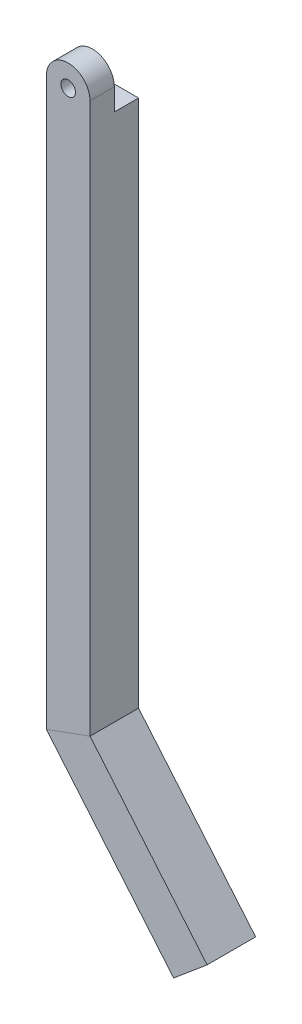
ISO-10303-21;
HEADER;
FILE_DESCRIPTION(('STEP AP214'),'2;1');
FILE_NAME('part.step','',(''),(''),'','','');
FILE_SCHEMA(('AUTOMOTIVE_DESIGN { 1 0 10303 214 1 1 1 1 }'));
ENDSEC;
DATA;
#1=APPLICATION_CONTEXT('core data for automotive mechanical design processes');
#2=APPLICATION_PROTOCOL_DEFINITION('international standard','automotive_design',2000,#1);
#3=PRODUCT_CONTEXT('',#1,'mechanical');
#4=PRODUCT('Part','Part','',(#3));
#5=PRODUCT_RELATED_PRODUCT_CATEGORY('part','',(#4));
#6=PRODUCT_DEFINITION_FORMATION('','',#4);
#7=PRODUCT_DEFINITION_CONTEXT('part definition',#1,'design');
#8=PRODUCT_DEFINITION('design','',#6,#7);
#9=PRODUCT_DEFINITION_SHAPE('','',#8);
#10=(LENGTH_UNIT() NAMED_UNIT(*) SI_UNIT(.MILLI.,.METRE.));
#11=(NAMED_UNIT(*) PLANE_ANGLE_UNIT() SI_UNIT($,.RADIAN.));
#12=(NAMED_UNIT(*) SI_UNIT($,.STERADIAN.) SOLID_ANGLE_UNIT());
#13=UNCERTAINTY_MEASURE_WITH_UNIT(LENGTH_MEASURE(1.E-05),#10,'distance_accuracy_value','');
#14=(GEOMETRIC_REPRESENTATION_CONTEXT(3) GLOBAL_UNCERTAINTY_ASSIGNED_CONTEXT((#13)) GLOBAL_UNIT_ASSIGNED_CONTEXT((#10,
#11,#12)) REPRESENTATION_CONTEXT('',''));
#15=CARTESIAN_POINT('',(0.,0.,0.));
#16=DIRECTION('',(0.,0.,1.));
#17=DIRECTION('',(1.,0.,0.));
#18=AXIS2_PLACEMENT_3D('',#15,#16,#17);
#19=CARTESIAN_POINT('',(-19.8,5.,-1.04285714285714));
#20=DIRECTION('',(0.,0.,1.));
#21=DIRECTION('',(1.,0.,0.));
#22=AXIS2_PLACEMENT_3D('',#19,#20,#21);
#23=CYLINDRICAL_SURFACE('',#22,4.5);
#24=CARTESIAN_POINT('',(-19.8,4.99999999999998,3.95714285714286));
#25=DIRECTION('',(0.,0.,1.));
#26=DIRECTION('',(-1.,0.,0.));
#27=AXIS2_PLACEMENT_3D('',#24,#25,#26);
#28=CIRCLE('',#27,4.5);
#29=CARTESIAN_POINT('',(-15.3,5.,3.95714285714286));
#30=VERTEX_POINT('',#29);
#31=CARTESIAN_POINT('',(-24.3,5.,3.95714285714286));
#32=VERTEX_POINT('',#31);
#33=EDGE_CURVE('E124',#30,#32,#28,.T.);
#34=ORIENTED_EDGE('',*,*,#33,.T.);
#35=DIRECTION('',(0.,0.,1.));
#36=VECTOR('',#35,1.);
#37=CARTESIAN_POINT('',(-24.3,5.,-1.04285714285714));
#38=LINE('',#37,#36);
#39=CARTESIAN_POINT('',(-24.3,5.,8.95714285714286));
#40=VERTEX_POINT('',#39);
#41=EDGE_CURVE('E122',#32,#40,#38,.T.);
#42=ORIENTED_EDGE('',*,*,#41,.T.);
#43=CARTESIAN_POINT('',(-19.8,5.,8.95714285714286));
#44=DIRECTION('',(0.,0.,-1.));
#45=DIRECTION('',(-1.,0.,0.));
#46=AXIS2_PLACEMENT_3D('',#43,#44,#45);
#47=CIRCLE('',#46,4.5);
#48=CARTESIAN_POINT('',(-15.3,5.,8.95714285714286));
#49=VERTEX_POINT('',#48);
#50=EDGE_CURVE('E140',#40,#49,#47,.T.);
#51=ORIENTED_EDGE('',*,*,#50,.T.);
#52=DIRECTION('',(0.,0.,1.));
#53=VECTOR('',#52,1.);
#54=CARTESIAN_POINT('',(-15.3,5.,-1.04285714285714));
#55=LINE('',#54,#53);
#56=EDGE_CURVE('E63',#30,#49,#55,.T.);
#57=ORIENTED_EDGE('',*,*,#56,.F.);
#58=EDGE_LOOP('',(#34,#42,#51,#57));
#59=FACE_BOUND('',#58,.T.);
#60=ADVANCED_FACE('F39',(#59),#23,.T.);
#61=CARTESIAN_POINT('',(-15.3,10.,-1.04285714285714));
#62=DIRECTION('',(-1.,0.,0.));
#63=DIRECTION('',(0.,0.,1.));
#64=AXIS2_PLACEMENT_3D('',#61,#62,#63);
#65=PLANE('',#64);
#66=DIRECTION('',(0.,-1.,0.));
#67=VECTOR('',#66,1.);
#68=CARTESIAN_POINT('',(-15.3,10.,-1.04285714285714));
#69=LINE('',#68,#67);
#70=CARTESIAN_POINT('',(-15.3,0.5,-1.04285714285714));
#71=VERTEX_POINT('',#70);
#72=CARTESIAN_POINT('',(-15.3,-108.362133945802,-1.04285714285714));
#73=VERTEX_POINT('',#72);
#74=EDGE_CURVE('E189',#71,#73,#69,.T.);
#75=ORIENTED_EDGE('',*,*,#74,.F.);
#76=DIRECTION('',(0.,0.,1.));
#77=VECTOR('',#76,1.);
#78=CARTESIAN_POINT('',(-15.3,0.5,-6.04285714285714));
#79=LINE('',#78,#77);
#80=CARTESIAN_POINT('',(-15.3,0.5,3.95714285714286));
#81=VERTEX_POINT('',#80);
#82=EDGE_CURVE('E113',#71,#81,#79,.T.);
#83=ORIENTED_EDGE('',*,*,#82,.T.);
#84=DIRECTION('',(0.,1.,0.));
#85=VECTOR('',#84,1.);
#86=CARTESIAN_POINT('',(-15.3,0.5,3.95714285714286));
#87=LINE('',#86,#85);
#88=EDGE_CURVE('E114',#81,#30,#87,.T.);
#89=ORIENTED_EDGE('',*,*,#88,.T.);
#90=ORIENTED_EDGE('',*,*,#56,.T.);
#91=DIRECTION('',(0.,-1.,0.));
#92=VECTOR('',#91,1.);
#93=CARTESIAN_POINT('',(-15.3,10.,8.95714285714286));
#94=LINE('',#93,#92);
#95=CARTESIAN_POINT('',(-15.3,-108.362133945802,8.95714285714286));
#96=VERTEX_POINT('',#95);
#97=EDGE_CURVE('E192',#49,#96,#94,.T.);
#98=ORIENTED_EDGE('',*,*,#97,.T.);
#99=DIRECTION('',(0.,0.,1.));
#100=VECTOR('',#99,1.);
#101=CARTESIAN_POINT('',(-15.3,-108.362133945802,-1.04285714285714));
#102=LINE('',#101,#100);
#103=EDGE_CURVE('E149',#73,#96,#102,.T.);
#104=ORIENTED_EDGE('',*,*,#103,.F.);
#105=EDGE_LOOP('',(#75,#83,#89,#90,#98,#104));
#106=FACE_BOUND('',#105,.T.);
#107=ADVANCED_FACE('F216',(#106),#65,.F.);
#108=CARTESIAN_POINT('',(-24.3,10.,8.95714285714286));
#109=DIRECTION('',(1.,0.,0.));
#110=DIRECTION('',(0.,0.,-1.));
#111=AXIS2_PLACEMENT_3D('',#108,#109,#110);
#112=PLANE('',#111);
#113=DIRECTION('',(0.,-1.,0.));
#114=VECTOR('',#113,1.);
#115=CARTESIAN_POINT('',(-24.3,4.99999999999997,3.95714285714286));
#116=LINE('',#115,#114);
#117=CARTESIAN_POINT('',(-24.3,0.5,3.95714285714286));
#118=VERTEX_POINT('',#117);
#119=EDGE_CURVE('E55',#32,#118,#116,.T.);
#120=ORIENTED_EDGE('',*,*,#119,.T.);
#121=DIRECTION('',(0.,0.,1.));
#122=VECTOR('',#121,1.);
#123=CARTESIAN_POINT('',(-24.3,0.5,-6.04285714285714));
#124=LINE('',#123,#122);
#125=CARTESIAN_POINT('',(-24.3,0.5,-1.04285714285714));
#126=VERTEX_POINT('',#125);
#127=EDGE_CURVE('E106',#126,#118,#124,.T.);
#128=ORIENTED_EDGE('',*,*,#127,.F.);
#129=DIRECTION('',(0.,-1.,0.));
#130=VECTOR('',#129,1.);
#131=CARTESIAN_POINT('',(-24.3,10.,-1.04285714285714));
#132=LINE('',#131,#130);
#133=CARTESIAN_POINT('',(-24.3,-111.637866054198,-1.04285714285714));
#134=VERTEX_POINT('',#133);
#135=EDGE_CURVE('E184',#126,#134,#132,.T.);
#136=ORIENTED_EDGE('',*,*,#135,.T.);
#137=DIRECTION('',(0.,0.,-1.));
#138=VECTOR('',#137,1.);
#139=CARTESIAN_POINT('',(-24.3,-111.637866054198,8.95714285714284));
#140=LINE('',#139,#138);
#141=CARTESIAN_POINT('',(-24.3,-111.637866054198,8.95714285714286));
#142=VERTEX_POINT('',#141);
#143=EDGE_CURVE('E141',#142,#134,#140,.T.);
#144=ORIENTED_EDGE('',*,*,#143,.F.);
#145=DIRECTION('',(0.,-1.,0.));
#146=VECTOR('',#145,1.);
#147=CARTESIAN_POINT('',(-24.3,10.,8.95714285714286));
#148=LINE('',#147,#146);
#149=EDGE_CURVE('E48',#40,#142,#148,.T.);
#150=ORIENTED_EDGE('',*,*,#149,.F.);
#151=ORIENTED_EDGE('',*,*,#41,.F.);
#152=EDGE_LOOP('',(#120,#128,#136,#144,#150,#151));
#153=FACE_BOUND('',#152,.T.);
#154=ADVANCED_FACE('F41',(#153),#112,.F.);
#155=CARTESIAN_POINT('',(-15.3,10.,8.95714285714286));
#156=DIRECTION('',(0.,0.,-1.));
#157=DIRECTION('',(-1.,0.,0.));
#158=AXIS2_PLACEMENT_3D('',#155,#156,#157);
#159=PLANE('',#158);
#160=CARTESIAN_POINT('',(-19.8,4.99999999999998,8.95714285714286));
#161=DIRECTION('',(0.,0.,-1.));
#162=DIRECTION('',(-1.,0.,0.));
#163=AXIS2_PLACEMENT_3D('',#160,#161,#162);
#164=CIRCLE('',#163,1.5);
#165=CARTESIAN_POINT('',(-21.3,4.99999999999998,8.95714285714286));
#166=VERTEX_POINT('',#165);
#167=EDGE_CURVE('E127',#166,#166,#164,.T.);
#168=ORIENTED_EDGE('',*,*,#167,.T.);
#169=EDGE_LOOP('',(#168));
#170=FACE_BOUND('',#169,.T.);
#171=ORIENTED_EDGE('',*,*,#97,.F.);
#172=ORIENTED_EDGE('',*,*,#50,.F.);
#173=ORIENTED_EDGE('',*,*,#149,.T.);
#174=DIRECTION('',(-0.939692620785908,-0.342020143325669,0.));
#175=VECTOR('',#174,1.);
#176=CARTESIAN_POINT('',(19.5269185297774,-95.686172249749,8.95714285714286));
#177=LINE('',#176,#175);
#178=EDGE_CURVE('E145',#96,#142,#177,.T.);
#179=ORIENTED_EDGE('',*,*,#178,.F.);
#180=EDGE_LOOP('',(#171,#172,#173,#179));
#181=FACE_BOUND('',#180,.T.);
#182=ADVANCED_FACE('F200',(#170,#181),#159,.F.);
#183=CARTESIAN_POINT('',(-24.3,10.,-1.04285714285714));
#184=DIRECTION('',(0.,0.,1.));
#185=DIRECTION('',(1.,0.,0.));
#186=AXIS2_PLACEMENT_3D('',#183,#184,#185);
#187=PLANE('',#186);
#188=ORIENTED_EDGE('',*,*,#135,.F.);
#189=DIRECTION('',(1.,0.,0.));
#190=VECTOR('',#189,1.);
#191=CARTESIAN_POINT('',(-24.3,0.5,-1.04285714285714));
#192=LINE('',#191,#190);
#193=EDGE_CURVE('E11',#126,#71,#192,.T.);
#194=ORIENTED_EDGE('',*,*,#193,.T.);
#195=ORIENTED_EDGE('',*,*,#74,.T.);
#196=DIRECTION('',(0.939692620785908,0.342020143325669,0.));
#197=VECTOR('',#196,1.);
#198=CARTESIAN_POINT('',(11.579718535742,-98.5787164933384,-1.04285714285714));
#199=LINE('',#198,#197);
#200=EDGE_CURVE('E136',#134,#73,#199,.T.);
#201=ORIENTED_EDGE('',*,*,#200,.F.);
#202=EDGE_LOOP('',(#188,#194,#195,#201));
#203=FACE_BOUND('',#202,.T.);
#204=ADVANCED_FACE('F218',(#203),#187,.F.);
#205=CARTESIAN_POINT('',(20.5406689090742,-127.272805328207,0.));
#206=DIRECTION('',(0.64278760968654,-0.766044443118977,0.));
#207=DIRECTION('',(0.,0.,-1.));
#208=AXIS2_PLACEMENT_3D('',#205,#206,#207);
#209=PLANE('',#208);
#210=DIRECTION('',(0.,0.,1.));
#211=VECTOR('',#210,1.);
#212=CARTESIAN_POINT('',(1.92578894128309,-142.892544243589,8.95714285714286));
#213=LINE('',#212,#211);
#214=CARTESIAN_POINT('',(1.9257889412831,-142.892544243589,-1.04285714285714));
#215=VERTEX_POINT('',#214);
#216=CARTESIAN_POINT('',(1.92578894128309,-142.892544243589,8.95714285714286));
#217=VERTEX_POINT('',#216);
#218=EDGE_CURVE('E156',#215,#217,#213,.T.);
#219=ORIENTED_EDGE('',*,*,#218,.F.);
#220=DIRECTION('',(-0.766044443118977,-0.64278760968654,0.));
#221=VECTOR('',#220,1.);
#222=CARTESIAN_POINT('',(1.9257889412831,-142.892544243589,-1.04285714285714));
#223=LINE('',#222,#221);
#224=CARTESIAN_POINT('',(8.82018892935388,-137.107455756411,-1.04285714285714));
#225=VERTEX_POINT('',#224);
#226=EDGE_CURVE('E159',#225,#215,#223,.T.);
#227=ORIENTED_EDGE('',*,*,#226,.F.);
#228=DIRECTION('',(0.,0.,-1.));
#229=VECTOR('',#228,1.);
#230=CARTESIAN_POINT('',(8.82018892935389,-137.107455756411,-1.04285714285714));
#231=LINE('',#230,#229);
#232=CARTESIAN_POINT('',(8.82018892935388,-137.107455756411,8.95714285714286));
#233=VERTEX_POINT('',#232);
#234=EDGE_CURVE('E162',#233,#225,#231,.T.);
#235=ORIENTED_EDGE('',*,*,#234,.F.);
#236=DIRECTION('',(0.766044443118977,0.64278760968654,0.));
#237=VECTOR('',#236,1.);
#238=CARTESIAN_POINT('',(8.82018892935389,-137.107455756411,8.95714285714286));
#239=LINE('',#238,#237);
#240=EDGE_CURVE('E134',#217,#233,#239,.T.);
#241=ORIENTED_EDGE('',*,*,#240,.F.);
#242=EDGE_LOOP('',(#219,#227,#235,#241));
#243=FACE_BOUND('',#242,.T.);
#244=ADVANCED_FACE('F224',(#243),#209,.T.);
#245=CARTESIAN_POINT('',(-17.5751587734943,-105.650705303768,-1.04285714285714));
#246=DIRECTION('',(-0.766044443118977,-0.64278760968654,0.));
#247=DIRECTION('',(0.64278760968654,-0.766044443118977,0.));
#248=AXIS2_PLACEMENT_3D('',#245,#246,#247);
#249=PLANE('',#248);
#250=ORIENTED_EDGE('',*,*,#103,.T.);
#251=DIRECTION('',(0.64278760968654,-0.766044443118977,0.));
#252=VECTOR('',#251,1.);
#253=CARTESIAN_POINT('',(-17.5751587734943,-105.650705303768,8.95714285714286));
#254=LINE('',#253,#252);
#255=EDGE_CURVE('E153',#96,#233,#254,.T.);
#256=ORIENTED_EDGE('',*,*,#255,.T.);
#257=ORIENTED_EDGE('',*,*,#234,.T.);
#258=DIRECTION('',(0.64278760968654,-0.766044443118977,0.));
#259=VECTOR('',#258,1.);
#260=CARTESIAN_POINT('',(-17.5751587734943,-105.650705303768,-1.04285714285714));
#261=LINE('',#260,#259);
#262=EDGE_CURVE('E173',#73,#225,#261,.T.);
#263=ORIENTED_EDGE('',*,*,#262,.F.);
#264=EDGE_LOOP('',(#250,#256,#257,#263));
#265=FACE_BOUND('',#264,.T.);
#266=ADVANCED_FACE('F214',(#265),#249,.F.);
#267=CARTESIAN_POINT('',(-24.4695587615651,-111.435793790947,-1.04285714285714));
#268=DIRECTION('',(0.,0.,1.));
#269=DIRECTION('',(1.,0.,0.));
#270=AXIS2_PLACEMENT_3D('',#267,#268,#269);
#271=PLANE('',#270);
#272=ORIENTED_EDGE('',*,*,#200,.T.);
#273=ORIENTED_EDGE('',*,*,#262,.T.);
#274=ORIENTED_EDGE('',*,*,#226,.T.);
#275=DIRECTION('',(0.64278760968654,-0.766044443118977,0.));
#276=VECTOR('',#275,1.);
#277=CARTESIAN_POINT('',(-24.4695587615651,-111.435793790947,-1.04285714285714));
#278=LINE('',#277,#276);
#279=EDGE_CURVE('E169',#134,#215,#278,.T.);
#280=ORIENTED_EDGE('',*,*,#279,.F.);
#281=EDGE_LOOP('',(#272,#273,#274,#280));
#282=FACE_BOUND('',#281,.T.);
#283=ADVANCED_FACE('F221',(#282),#271,.F.);
#284=CARTESIAN_POINT('',(-24.4695587615651,-111.435793790947,8.95714285714286));
#285=DIRECTION('',(0.766044443118977,0.64278760968654,0.));
#286=DIRECTION('',(-0.64278760968654,0.766044443118977,0.));
#287=AXIS2_PLACEMENT_3D('',#284,#285,#286);
#288=PLANE('',#287);
#289=ORIENTED_EDGE('',*,*,#143,.T.);
#290=ORIENTED_EDGE('',*,*,#279,.T.);
#291=ORIENTED_EDGE('',*,*,#218,.T.);
#292=DIRECTION('',(0.64278760968654,-0.766044443118977,0.));
#293=VECTOR('',#292,1.);
#294=CARTESIAN_POINT('',(-24.4695587615651,-111.435793790947,8.95714285714286));
#295=LINE('',#294,#293);
#296=EDGE_CURVE('E165',#142,#217,#295,.T.);
#297=ORIENTED_EDGE('',*,*,#296,.F.);
#298=EDGE_LOOP('',(#289,#290,#291,#297));
#299=FACE_BOUND('',#298,.T.);
#300=ADVANCED_FACE('F205',(#299),#288,.F.);
#301=CARTESIAN_POINT('',(-17.5751587734943,-105.650705303768,8.95714285714286));
#302=DIRECTION('',(0.,0.,-1.));
#303=DIRECTION('',(-1.,0.,0.));
#304=AXIS2_PLACEMENT_3D('',#301,#302,#303);
#305=PLANE('',#304);
#306=ORIENTED_EDGE('',*,*,#178,.T.);
#307=ORIENTED_EDGE('',*,*,#296,.T.);
#308=ORIENTED_EDGE('',*,*,#240,.T.);
#309=ORIENTED_EDGE('',*,*,#255,.F.);
#310=EDGE_LOOP('',(#306,#307,#308,#309));
#311=FACE_BOUND('',#310,.T.);
#312=ADVANCED_FACE('F209',(#311),#305,.F.);
#313=CARTESIAN_POINT('',(-24.3,0.5,-6.04285714285714));
#314=DIRECTION('',(0.,-1.,0.));
#315=DIRECTION('',(0.,0.,-1.));
#316=AXIS2_PLACEMENT_3D('',#313,#314,#315);
#317=PLANE('',#316);
#318=ORIENTED_EDGE('',*,*,#127,.T.);
#319=DIRECTION('',(1.,0.,0.));
#320=VECTOR('',#319,1.);
#321=CARTESIAN_POINT('',(-24.3,0.5,3.95714285714286));
#322=LINE('',#321,#320);
#323=EDGE_CURVE('E108',#118,#81,#322,.T.);
#324=ORIENTED_EDGE('',*,*,#323,.T.);
#325=ORIENTED_EDGE('',*,*,#82,.F.);
#326=ORIENTED_EDGE('',*,*,#193,.F.);
#327=EDGE_LOOP('',(#318,#324,#325,#326));
#328=FACE_BOUND('',#327,.T.);
#329=ADVANCED_FACE('F107',(#328),#317,.F.);
#330=CARTESIAN_POINT('',(-19.8,4.99999999999998,3.95714285714286));
#331=DIRECTION('',(0.,0.,-1.));
#332=DIRECTION('',(-1.,0.,0.));
#333=AXIS2_PLACEMENT_3D('',#330,#331,#332);
#334=PLANE('',#333);
#335=CARTESIAN_POINT('',(-19.8,4.99999999999998,3.95714285714286));
#336=DIRECTION('',(0.,0.,-1.));
#337=DIRECTION('',(-1.,0.,0.));
#338=AXIS2_PLACEMENT_3D('',#335,#336,#337);
#339=CIRCLE('',#338,1.5);
#340=CARTESIAN_POINT('',(-21.3,4.99999999999998,3.95714285714286));
#341=VERTEX_POINT('',#340);
#342=EDGE_CURVE('E252',#341,#341,#339,.T.);
#343=ORIENTED_EDGE('',*,*,#342,.F.);
#344=EDGE_LOOP('',(#343));
#345=FACE_BOUND('',#344,.T.);
#346=ORIENTED_EDGE('',*,*,#33,.F.);
#347=ORIENTED_EDGE('',*,*,#88,.F.);
#348=ORIENTED_EDGE('',*,*,#323,.F.);
#349=ORIENTED_EDGE('',*,*,#119,.F.);
#350=EDGE_LOOP('',(#346,#347,#348,#349));
#351=FACE_BOUND('',#350,.T.);
#352=ADVANCED_FACE('F116',(#345,#351),#334,.T.);
#353=CARTESIAN_POINT('',(-19.8,4.99999999999998,13.9571428571429));
#354=DIRECTION('',(0.,0.,-1.));
#355=DIRECTION('',(-1.,0.,0.));
#356=AXIS2_PLACEMENT_3D('',#353,#354,#355);
#357=CYLINDRICAL_SURFACE('',#356,1.5);
#358=ORIENTED_EDGE('',*,*,#342,.T.);
#359=EDGE_LOOP('',(#358));
#360=FACE_BOUND('',#359,.T.);
#361=ORIENTED_EDGE('',*,*,#167,.F.);
#362=EDGE_LOOP('',(#361));
#363=FACE_BOUND('',#362,.T.);
#364=ADVANCED_FACE('F258',(#360,#363),#357,.F.);
#365=CLOSED_SHELL('',(#60,#107,#154,#182,#204,#244,#266,#283,#300,#312,#329,#352,#364));
#366=MANIFOLD_SOLID_BREP('B2',#365);
#367=ADVANCED_BREP_SHAPE_REPRESENTATION('',(#18,#366),#14);
#368=SHAPE_DEFINITION_REPRESENTATION(#9,#367);
ENDSEC;
END-ISO-10303-21;
